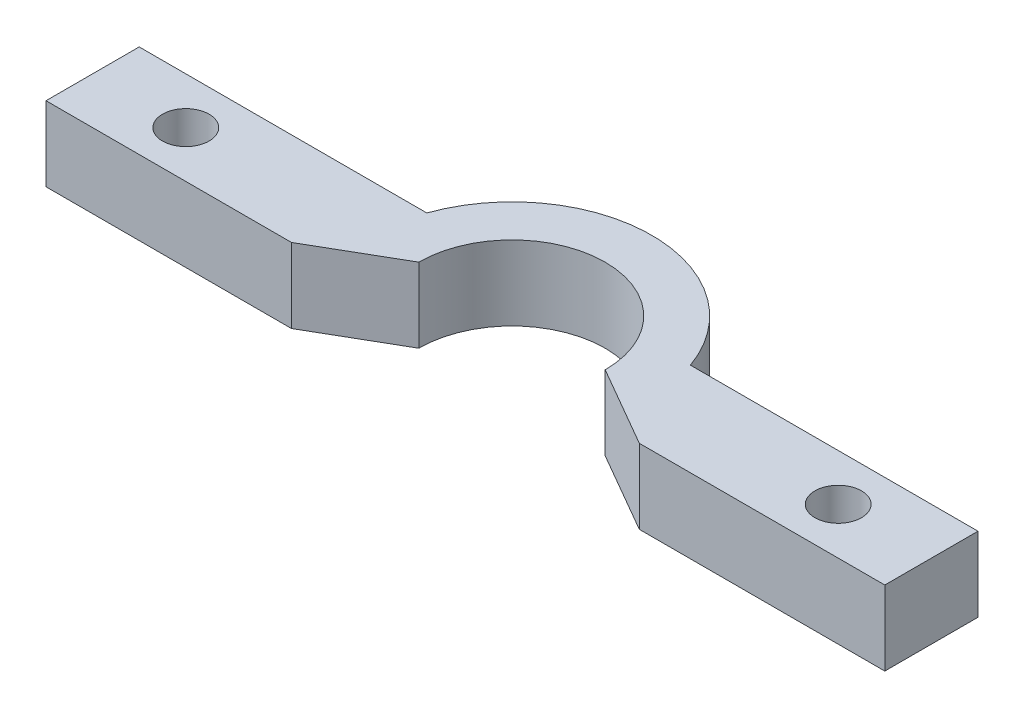
ISO-10303-21;
HEADER;
FILE_DESCRIPTION(('STEP AP214'),'2;1');
FILE_NAME('part.step','',(''),(''),'','','');
FILE_SCHEMA(('AUTOMOTIVE_DESIGN { 1 0 10303 214 1 1 1 1 }'));
ENDSEC;
DATA;
#1=APPLICATION_CONTEXT('core data for automotive mechanical design processes');
#2=APPLICATION_PROTOCOL_DEFINITION('international standard','automotive_design',2000,#1);
#3=PRODUCT_CONTEXT('',#1,'mechanical');
#4=PRODUCT('Part','Part','',(#3));
#5=PRODUCT_RELATED_PRODUCT_CATEGORY('part','',(#4));
#6=PRODUCT_DEFINITION_FORMATION('','',#4);
#7=PRODUCT_DEFINITION_CONTEXT('part definition',#1,'design');
#8=PRODUCT_DEFINITION('design','',#6,#7);
#9=PRODUCT_DEFINITION_SHAPE('','',#8);
#10=(LENGTH_UNIT() NAMED_UNIT(*) SI_UNIT(.MILLI.,.METRE.));
#11=(NAMED_UNIT(*) PLANE_ANGLE_UNIT() SI_UNIT($,.RADIAN.));
#12=(NAMED_UNIT(*) SI_UNIT($,.STERADIAN.) SOLID_ANGLE_UNIT());
#13=UNCERTAINTY_MEASURE_WITH_UNIT(LENGTH_MEASURE(1.E-05),#10,'distance_accuracy_value','');
#14=(GEOMETRIC_REPRESENTATION_CONTEXT(3) GLOBAL_UNCERTAINTY_ASSIGNED_CONTEXT((#13)) GLOBAL_UNIT_ASSIGNED_CONTEXT((#10,
#11,#12)) REPRESENTATION_CONTEXT('',''));
#15=CARTESIAN_POINT('',(0.,0.,0.));
#16=DIRECTION('',(0.,0.,1.));
#17=DIRECTION('',(1.,0.,0.));
#18=AXIS2_PLACEMENT_3D('',#15,#16,#17);
#19=CARTESIAN_POINT('',(-0.793750000000001,1.27,-1.3748153285078));
#20=DIRECTION('',(0.5,0.,0.866025403784439));
#21=DIRECTION('',(0.866025403784439,0.,-0.5));
#22=AXIS2_PLACEMENT_3D('',#19,#20,#21);
#23=PLANE('',#22);
#24=DIRECTION('',(-0.866025403784439,0.,0.5));
#25=VECTOR('',#24,1.);
#26=CARTESIAN_POINT('',(-0.793750000000001,-1.27,-1.3748153285078));
#27=LINE('',#26,#25);
#28=CARTESIAN_POINT('',(-3.175,-1.27,0.));
#29=VERTEX_POINT('',#28);
#30=CARTESIAN_POINT('',(-5.9246306570156,-1.27,1.5875));
#31=VERTEX_POINT('',#30);
#32=EDGE_CURVE('E149',#29,#31,#27,.T.);
#33=ORIENTED_EDGE('',*,*,#32,.F.);
#34=DIRECTION('',(0.,-1.,0.));
#35=VECTOR('',#34,1.);
#36=CARTESIAN_POINT('',(-3.175,1.27,0.));
#37=LINE('',#36,#35);
#38=CARTESIAN_POINT('',(-3.175,1.27,0.));
#39=VERTEX_POINT('',#38);
#40=EDGE_CURVE('E11',#39,#29,#37,.T.);
#41=ORIENTED_EDGE('',*,*,#40,.F.);
#42=DIRECTION('',(-0.866025403784439,0.,0.5));
#43=VECTOR('',#42,1.);
#44=CARTESIAN_POINT('',(-0.793750000000001,1.27,-1.3748153285078));
#45=LINE('',#44,#43);
#46=CARTESIAN_POINT('',(-5.9246306570156,1.27,1.5875));
#47=VERTEX_POINT('',#46);
#48=EDGE_CURVE('E215',#39,#47,#45,.T.);
#49=ORIENTED_EDGE('',*,*,#48,.T.);
#50=DIRECTION('',(0.,-1.,0.));
#51=VECTOR('',#50,1.);
#52=CARTESIAN_POINT('',(-5.9246306570156,1.27,1.5875));
#53=LINE('',#52,#51);
#54=EDGE_CURVE('E93',#47,#31,#53,.T.);
#55=ORIENTED_EDGE('',*,*,#54,.T.);
#56=EDGE_LOOP('',(#33,#41,#49,#55));
#57=FACE_BOUND('',#56,.T.);
#58=ADVANCED_FACE('F36',(#57),#23,.T.);
#59=CARTESIAN_POINT('',(0.,1.27,0.));
#60=DIRECTION('',(0.,-1.,0.));
#61=DIRECTION('',(0.,0.,-1.));
#62=AXIS2_PLACEMENT_3D('',#59,#60,#61);
#63=CYLINDRICAL_SURFACE('',#62,3.175);
#64=CARTESIAN_POINT('',(0.,-1.27,0.));
#65=DIRECTION('',(0.,1.,0.));
#66=DIRECTION('',(0.,0.,1.));
#67=AXIS2_PLACEMENT_3D('',#64,#65,#66);
#68=CIRCLE('',#67,3.175);
#69=CARTESIAN_POINT('',(3.175,-1.27,0.));
#70=VERTEX_POINT('',#69);
#71=EDGE_CURVE('E152',#70,#29,#68,.T.);
#72=ORIENTED_EDGE('',*,*,#71,.F.);
#73=DIRECTION('',(0.,-1.,0.));
#74=VECTOR('',#73,1.);
#75=CARTESIAN_POINT('',(3.175,1.27,0.));
#76=LINE('',#75,#74);
#77=CARTESIAN_POINT('',(3.175,1.27,0.));
#78=VERTEX_POINT('',#77);
#79=EDGE_CURVE('E45',#78,#70,#76,.T.);
#80=ORIENTED_EDGE('',*,*,#79,.F.);
#81=CARTESIAN_POINT('',(0.,1.27,0.));
#82=DIRECTION('',(0.,1.,0.));
#83=DIRECTION('',(0.,0.,1.));
#84=AXIS2_PLACEMENT_3D('',#81,#82,#83);
#85=CIRCLE('',#84,3.175);
#86=EDGE_CURVE('E213',#78,#39,#85,.T.);
#87=ORIENTED_EDGE('',*,*,#86,.T.);
#88=ORIENTED_EDGE('',*,*,#40,.T.);
#89=EDGE_LOOP('',(#72,#80,#87,#88));
#90=FACE_BOUND('',#89,.T.);
#91=ADVANCED_FACE('F200',(#90),#63,.F.);
#92=CARTESIAN_POINT('',(0.793750000000001,1.27,-1.3748153285078));
#93=DIRECTION('',(-0.5,0.,0.866025403784439));
#94=DIRECTION('',(0.866025403784439,0.,0.5));
#95=AXIS2_PLACEMENT_3D('',#92,#93,#94);
#96=PLANE('',#95);
#97=DIRECTION('',(-0.866025403784439,0.,-0.5));
#98=VECTOR('',#97,1.);
#99=CARTESIAN_POINT('',(0.793750000000001,-1.27,-1.3748153285078));
#100=LINE('',#99,#98);
#101=CARTESIAN_POINT('',(5.92463065701559,-1.27,1.5875));
#102=VERTEX_POINT('',#101);
#103=EDGE_CURVE('E155',#102,#70,#100,.T.);
#104=ORIENTED_EDGE('',*,*,#103,.F.);
#105=DIRECTION('',(0.,-1.,0.));
#106=VECTOR('',#105,1.);
#107=CARTESIAN_POINT('',(5.92463065701559,1.27,1.5875));
#108=LINE('',#107,#106);
#109=CARTESIAN_POINT('',(5.92463065701559,1.27,1.5875));
#110=VERTEX_POINT('',#109);
#111=EDGE_CURVE('E189',#110,#102,#108,.T.);
#112=ORIENTED_EDGE('',*,*,#111,.F.);
#113=DIRECTION('',(-0.866025403784439,0.,-0.5));
#114=VECTOR('',#113,1.);
#115=CARTESIAN_POINT('',(0.793750000000001,1.27,-1.3748153285078));
#116=LINE('',#115,#114);
#117=EDGE_CURVE('E196',#110,#78,#116,.T.);
#118=ORIENTED_EDGE('',*,*,#117,.T.);
#119=ORIENTED_EDGE('',*,*,#79,.T.);
#120=EDGE_LOOP('',(#104,#112,#118,#119));
#121=FACE_BOUND('',#120,.T.);
#122=ADVANCED_FACE('F194',(#121),#96,.T.);
#123=CARTESIAN_POINT('',(0.,1.27,1.5875));
#124=DIRECTION('',(0.,0.,-1.));
#125=DIRECTION('',(-1.,0.,0.));
#126=AXIS2_PLACEMENT_3D('',#123,#124,#125);
#127=PLANE('',#126);
#128=DIRECTION('',(1.,0.,0.));
#129=VECTOR('',#128,1.);
#130=CARTESIAN_POINT('',(0.,-1.27,1.5875));
#131=LINE('',#130,#129);
#132=CARTESIAN_POINT('',(14.2875,-1.27,1.5875));
#133=VERTEX_POINT('',#132);
#134=EDGE_CURVE('E158',#102,#133,#131,.T.);
#135=ORIENTED_EDGE('',*,*,#134,.T.);
#136=DIRECTION('',(0.,-1.,0.));
#137=VECTOR('',#136,1.);
#138=CARTESIAN_POINT('',(14.2875,1.27,1.5875));
#139=LINE('',#138,#137);
#140=CARTESIAN_POINT('',(14.2875,1.27,1.5875));
#141=VERTEX_POINT('',#140);
#142=EDGE_CURVE('E186',#141,#133,#139,.T.);
#143=ORIENTED_EDGE('',*,*,#142,.F.);
#144=DIRECTION('',(1.,0.,0.));
#145=VECTOR('',#144,1.);
#146=CARTESIAN_POINT('',(0.,1.27,1.5875));
#147=LINE('',#146,#145);
#148=EDGE_CURVE('E210',#110,#141,#147,.T.);
#149=ORIENTED_EDGE('',*,*,#148,.F.);
#150=ORIENTED_EDGE('',*,*,#111,.T.);
#151=EDGE_LOOP('',(#135,#143,#149,#150));
#152=FACE_BOUND('',#151,.T.);
#153=ADVANCED_FACE('F207',(#152),#127,.F.);
#154=CARTESIAN_POINT('',(14.2875,1.27,0.));
#155=DIRECTION('',(-1.,0.,0.));
#156=DIRECTION('',(0.,0.,1.));
#157=AXIS2_PLACEMENT_3D('',#154,#155,#156);
#158=PLANE('',#157);
#159=DIRECTION('',(0.,0.,-1.));
#160=VECTOR('',#159,1.);
#161=CARTESIAN_POINT('',(14.2875,-1.27,0.));
#162=LINE('',#161,#160);
#163=CARTESIAN_POINT('',(14.2875,-1.27,-1.5875));
#164=VERTEX_POINT('',#163);
#165=EDGE_CURVE('E161',#133,#164,#162,.T.);
#166=ORIENTED_EDGE('',*,*,#165,.T.);
#167=DIRECTION('',(0.,-1.,0.));
#168=VECTOR('',#167,1.);
#169=CARTESIAN_POINT('',(14.2875,1.27,-1.5875));
#170=LINE('',#169,#168);
#171=CARTESIAN_POINT('',(14.2875,1.27,-1.5875));
#172=VERTEX_POINT('',#171);
#173=EDGE_CURVE('E184',#172,#164,#170,.T.);
#174=ORIENTED_EDGE('',*,*,#173,.F.);
#175=DIRECTION('',(0.,0.,-1.));
#176=VECTOR('',#175,1.);
#177=CARTESIAN_POINT('',(14.2875,1.27,0.));
#178=LINE('',#177,#176);
#179=EDGE_CURVE('E211',#141,#172,#178,.T.);
#180=ORIENTED_EDGE('',*,*,#179,.F.);
#181=ORIENTED_EDGE('',*,*,#142,.T.);
#182=EDGE_LOOP('',(#166,#174,#180,#181));
#183=FACE_BOUND('',#182,.T.);
#184=ADVANCED_FACE('F227',(#183),#158,.F.);
#185=CARTESIAN_POINT('',(0.,1.27,-1.5875));
#186=DIRECTION('',(0.,0.,-1.));
#187=DIRECTION('',(-1.,0.,0.));
#188=AXIS2_PLACEMENT_3D('',#185,#186,#187);
#189=PLANE('',#188);
#190=DIRECTION('',(1.,0.,0.));
#191=VECTOR('',#190,1.);
#192=CARTESIAN_POINT('',(0.,-1.27,-1.5875));
#193=LINE('',#192,#191);
#194=CARTESIAN_POINT('',(4.49012806053458,-1.27,-1.5875));
#195=VERTEX_POINT('',#194);
#196=EDGE_CURVE('E164',#195,#164,#193,.T.);
#197=ORIENTED_EDGE('',*,*,#196,.F.);
#198=DIRECTION('',(0.,-1.,0.));
#199=VECTOR('',#198,1.);
#200=CARTESIAN_POINT('',(4.49012806053458,1.27,-1.5875));
#201=LINE('',#200,#199);
#202=CARTESIAN_POINT('',(4.49012806053458,1.27,-1.5875));
#203=VERTEX_POINT('',#202);
#204=EDGE_CURVE('E182',#203,#195,#201,.T.);
#205=ORIENTED_EDGE('',*,*,#204,.F.);
#206=DIRECTION('',(1.,0.,0.));
#207=VECTOR('',#206,1.);
#208=CARTESIAN_POINT('',(0.,1.27,-1.5875));
#209=LINE('',#208,#207);
#210=EDGE_CURVE('E220',#203,#172,#209,.T.);
#211=ORIENTED_EDGE('',*,*,#210,.T.);
#212=ORIENTED_EDGE('',*,*,#173,.T.);
#213=EDGE_LOOP('',(#197,#205,#211,#212));
#214=FACE_BOUND('',#213,.T.);
#215=ADVANCED_FACE('F224',(#214),#189,.T.);
#216=CARTESIAN_POINT('',(0.,1.27,0.));
#217=DIRECTION('',(0.,-1.,0.));
#218=DIRECTION('',(0.,0.,-1.));
#219=AXIS2_PLACEMENT_3D('',#216,#217,#218);
#220=CYLINDRICAL_SURFACE('',#219,4.7625);
#221=CARTESIAN_POINT('',(0.,-1.27,0.));
#222=DIRECTION('',(0.,1.,0.));
#223=DIRECTION('',(0.,0.,1.));
#224=AXIS2_PLACEMENT_3D('',#221,#222,#223);
#225=CIRCLE('',#224,4.7625);
#226=CARTESIAN_POINT('',(-4.49012806053458,-1.27,-1.5875));
#227=VERTEX_POINT('',#226);
#228=EDGE_CURVE('E167',#195,#227,#225,.T.);
#229=ORIENTED_EDGE('',*,*,#228,.T.);
#230=DIRECTION('',(0.,-1.,0.));
#231=VECTOR('',#230,1.);
#232=CARTESIAN_POINT('',(-4.49012806053458,1.27,-1.5875));
#233=LINE('',#232,#231);
#234=CARTESIAN_POINT('',(-4.49012806053458,1.27,-1.5875));
#235=VERTEX_POINT('',#234);
#236=EDGE_CURVE('E128',#235,#227,#233,.T.);
#237=ORIENTED_EDGE('',*,*,#236,.F.);
#238=CARTESIAN_POINT('',(0.,1.27,0.));
#239=DIRECTION('',(0.,1.,0.));
#240=DIRECTION('',(0.,0.,1.));
#241=AXIS2_PLACEMENT_3D('',#238,#239,#240);
#242=CIRCLE('',#241,4.7625);
#243=EDGE_CURVE('E135',#203,#235,#242,.T.);
#244=ORIENTED_EDGE('',*,*,#243,.F.);
#245=ORIENTED_EDGE('',*,*,#204,.T.);
#246=EDGE_LOOP('',(#229,#237,#244,#245));
#247=FACE_BOUND('',#246,.T.);
#248=ADVANCED_FACE('F230',(#247),#220,.T.);
#249=CARTESIAN_POINT('',(0.,1.27,-1.5875));
#250=DIRECTION('',(0.,0.,-1.));
#251=DIRECTION('',(-1.,0.,0.));
#252=AXIS2_PLACEMENT_3D('',#249,#250,#251);
#253=PLANE('',#252);
#254=DIRECTION('',(1.,0.,0.));
#255=VECTOR('',#254,1.);
#256=CARTESIAN_POINT('',(0.,-1.27,-1.5875));
#257=LINE('',#256,#255);
#258=CARTESIAN_POINT('',(-14.2875,-1.27,-1.5875));
#259=VERTEX_POINT('',#258);
#260=EDGE_CURVE('E123',#259,#227,#257,.T.);
#261=ORIENTED_EDGE('',*,*,#260,.F.);
#262=DIRECTION('',(0.,-1.,0.));
#263=VECTOR('',#262,1.);
#264=CARTESIAN_POINT('',(-14.2875,1.27,-1.5875));
#265=LINE('',#264,#263);
#266=CARTESIAN_POINT('',(-14.2875,1.27,-1.5875));
#267=VERTEX_POINT('',#266);
#268=EDGE_CURVE('E118',#267,#259,#265,.T.);
#269=ORIENTED_EDGE('',*,*,#268,.F.);
#270=DIRECTION('',(1.,0.,0.));
#271=VECTOR('',#270,1.);
#272=CARTESIAN_POINT('',(0.,1.27,-1.5875));
#273=LINE('',#272,#271);
#274=EDGE_CURVE('E121',#267,#235,#273,.T.);
#275=ORIENTED_EDGE('',*,*,#274,.T.);
#276=ORIENTED_EDGE('',*,*,#236,.T.);
#277=EDGE_LOOP('',(#261,#269,#275,#276));
#278=FACE_BOUND('',#277,.T.);
#279=ADVANCED_FACE('F120',(#278),#253,.T.);
#280=CARTESIAN_POINT('',(-14.2875,1.27,0.));
#281=DIRECTION('',(-1.,0.,0.));
#282=DIRECTION('',(0.,0.,1.));
#283=AXIS2_PLACEMENT_3D('',#280,#281,#282);
#284=PLANE('',#283);
#285=DIRECTION('',(0.,0.,-1.));
#286=VECTOR('',#285,1.);
#287=CARTESIAN_POINT('',(-14.2875,-1.27,0.));
#288=LINE('',#287,#286);
#289=CARTESIAN_POINT('',(-14.2875,-1.27,1.5875));
#290=VERTEX_POINT('',#289);
#291=EDGE_CURVE('E171',#290,#259,#288,.T.);
#292=ORIENTED_EDGE('',*,*,#291,.F.);
#293=DIRECTION('',(0.,-1.,0.));
#294=VECTOR('',#293,1.);
#295=CARTESIAN_POINT('',(-14.2875,1.27,1.5875));
#296=LINE('',#295,#294);
#297=CARTESIAN_POINT('',(-14.2875,1.27,1.5875));
#298=VERTEX_POINT('',#297);
#299=EDGE_CURVE('E86',#298,#290,#296,.T.);
#300=ORIENTED_EDGE('',*,*,#299,.F.);
#301=DIRECTION('',(0.,0.,-1.));
#302=VECTOR('',#301,1.);
#303=CARTESIAN_POINT('',(-14.2875,1.27,0.));
#304=LINE('',#303,#302);
#305=EDGE_CURVE('E132',#298,#267,#304,.T.);
#306=ORIENTED_EDGE('',*,*,#305,.T.);
#307=ORIENTED_EDGE('',*,*,#268,.T.);
#308=EDGE_LOOP('',(#292,#300,#306,#307));
#309=FACE_BOUND('',#308,.T.);
#310=ADVANCED_FACE('F138',(#309),#284,.T.);
#311=CARTESIAN_POINT('',(0.,1.27,1.5875));
#312=DIRECTION('',(0.,0.,-1.));
#313=DIRECTION('',(-1.,0.,0.));
#314=AXIS2_PLACEMENT_3D('',#311,#312,#313);
#315=PLANE('',#314);
#316=DIRECTION('',(1.,0.,0.));
#317=VECTOR('',#316,1.);
#318=CARTESIAN_POINT('',(0.,-1.27,1.5875));
#319=LINE('',#318,#317);
#320=EDGE_CURVE('E173',#290,#31,#319,.T.);
#321=ORIENTED_EDGE('',*,*,#320,.T.);
#322=ORIENTED_EDGE('',*,*,#54,.F.);
#323=DIRECTION('',(1.,0.,0.));
#324=VECTOR('',#323,1.);
#325=CARTESIAN_POINT('',(0.,1.27,1.5875));
#326=LINE('',#325,#324);
#327=EDGE_CURVE('E53',#298,#47,#326,.T.);
#328=ORIENTED_EDGE('',*,*,#327,.F.);
#329=ORIENTED_EDGE('',*,*,#299,.T.);
#330=EDGE_LOOP('',(#321,#322,#328,#329));
#331=FACE_BOUND('',#330,.T.);
#332=ADVANCED_FACE('F277',(#331),#315,.F.);
#333=CARTESIAN_POINT('',(-11.1125,1.27,0.));
#334=DIRECTION('',(0.,-1.,0.));
#335=DIRECTION('',(0.,0.,-1.));
#336=AXIS2_PLACEMENT_3D('',#333,#334,#335);
#337=CYLINDRICAL_SURFACE('',#336,0.793749999999999);
#338=CARTESIAN_POINT('',(-11.1125,1.27,0.));
#339=DIRECTION('',(0.,1.,0.));
#340=DIRECTION('',(0.,0.,1.));
#341=AXIS2_PLACEMENT_3D('',#338,#339,#340);
#342=CIRCLE('',#341,0.793749999999999);
#343=CARTESIAN_POINT('',(-11.1125,1.27,0.793749999999999));
#344=VERTEX_POINT('',#343);
#345=EDGE_CURVE('E178',#344,#344,#342,.T.);
#346=ORIENTED_EDGE('',*,*,#345,.T.);
#347=EDGE_LOOP('',(#346));
#348=FACE_BOUND('',#347,.T.);
#349=CARTESIAN_POINT('',(-11.1125,-1.27,0.));
#350=DIRECTION('',(0.,1.,0.));
#351=DIRECTION('',(0.,0.,1.));
#352=AXIS2_PLACEMENT_3D('',#349,#350,#351);
#353=CIRCLE('',#352,0.793749999999999);
#354=CARTESIAN_POINT('',(-11.1125,-1.27,0.793749999999999));
#355=VERTEX_POINT('',#354);
#356=EDGE_CURVE('E146',#355,#355,#353,.T.);
#357=ORIENTED_EDGE('',*,*,#356,.F.);
#358=EDGE_LOOP('',(#357));
#359=FACE_BOUND('',#358,.T.);
#360=ADVANCED_FACE('F38',(#348,#359),#337,.F.);
#361=CARTESIAN_POINT('',(11.1125,1.27,0.));
#362=DIRECTION('',(0.,-1.,0.));
#363=DIRECTION('',(0.,0.,-1.));
#364=AXIS2_PLACEMENT_3D('',#361,#362,#363);
#365=CYLINDRICAL_SURFACE('',#364,0.793749999999999);
#366=CARTESIAN_POINT('',(11.1125,1.27,0.));
#367=DIRECTION('',(0.,1.,0.));
#368=DIRECTION('',(0.,0.,1.));
#369=AXIS2_PLACEMENT_3D('',#366,#367,#368);
#370=CIRCLE('',#369,0.793749999999999);
#371=CARTESIAN_POINT('',(11.1125,1.27,0.793749999999999));
#372=VERTEX_POINT('',#371);
#373=EDGE_CURVE('E140',#372,#372,#370,.T.);
#374=ORIENTED_EDGE('',*,*,#373,.T.);
#375=EDGE_LOOP('',(#374));
#376=FACE_BOUND('',#375,.T.);
#377=CARTESIAN_POINT('',(11.1125,-1.27,0.));
#378=DIRECTION('',(0.,1.,0.));
#379=DIRECTION('',(0.,0.,1.));
#380=AXIS2_PLACEMENT_3D('',#377,#378,#379);
#381=CIRCLE('',#380,0.793749999999999);
#382=CARTESIAN_POINT('',(11.1125,-1.27,0.793749999999999));
#383=VERTEX_POINT('',#382);
#384=EDGE_CURVE('E175',#383,#383,#381,.T.);
#385=ORIENTED_EDGE('',*,*,#384,.F.);
#386=EDGE_LOOP('',(#385));
#387=FACE_BOUND('',#386,.T.);
#388=ADVANCED_FACE('F294',(#376,#387),#365,.F.);
#389=CARTESIAN_POINT('',(0.,1.27,0.));
#390=DIRECTION('',(0.,1.,0.));
#391=DIRECTION('',(0.,0.,1.));
#392=AXIS2_PLACEMENT_3D('',#389,#390,#391);
#393=PLANE('',#392);
#394=ORIENTED_EDGE('',*,*,#345,.F.);
#395=EDGE_LOOP('',(#394));
#396=FACE_BOUND('',#395,.T.);
#397=ORIENTED_EDGE('',*,*,#48,.F.);
#398=ORIENTED_EDGE('',*,*,#86,.F.);
#399=ORIENTED_EDGE('',*,*,#117,.F.);
#400=ORIENTED_EDGE('',*,*,#148,.T.);
#401=ORIENTED_EDGE('',*,*,#179,.T.);
#402=ORIENTED_EDGE('',*,*,#210,.F.);
#403=ORIENTED_EDGE('',*,*,#243,.T.);
#404=ORIENTED_EDGE('',*,*,#274,.F.);
#405=ORIENTED_EDGE('',*,*,#305,.F.);
#406=ORIENTED_EDGE('',*,*,#327,.T.);
#407=EDGE_LOOP('',(#397,#398,#399,#400,#401,#402,#403,#404,#405,#406));
#408=FACE_BOUND('',#407,.T.);
#409=ORIENTED_EDGE('',*,*,#373,.F.);
#410=EDGE_LOOP('',(#409));
#411=FACE_BOUND('',#410,.T.);
#412=ADVANCED_FACE('F130',(#396,#408,#411),#393,.T.);
#413=CARTESIAN_POINT('',(0.,-1.27,0.));
#414=DIRECTION('',(0.,1.,0.));
#415=DIRECTION('',(0.,0.,1.));
#416=AXIS2_PLACEMENT_3D('',#413,#414,#415);
#417=PLANE('',#416);
#418=ORIENTED_EDGE('',*,*,#356,.T.);
#419=EDGE_LOOP('',(#418));
#420=FACE_BOUND('',#419,.T.);
#421=ORIENTED_EDGE('',*,*,#32,.T.);
#422=ORIENTED_EDGE('',*,*,#320,.F.);
#423=ORIENTED_EDGE('',*,*,#291,.T.);
#424=ORIENTED_EDGE('',*,*,#260,.T.);
#425=ORIENTED_EDGE('',*,*,#228,.F.);
#426=ORIENTED_EDGE('',*,*,#196,.T.);
#427=ORIENTED_EDGE('',*,*,#165,.F.);
#428=ORIENTED_EDGE('',*,*,#134,.F.);
#429=ORIENTED_EDGE('',*,*,#103,.T.);
#430=ORIENTED_EDGE('',*,*,#71,.T.);
#431=EDGE_LOOP('',(#421,#422,#423,#424,#425,#426,#427,#428,#429,#430));
#432=FACE_BOUND('',#431,.T.);
#433=ORIENTED_EDGE('',*,*,#384,.T.);
#434=EDGE_LOOP('',(#433));
#435=FACE_BOUND('',#434,.T.);
#436=ADVANCED_FACE('F203',(#420,#432,#435),#417,.F.);
#437=CLOSED_SHELL('',(#58,#91,#122,#153,#184,#215,#248,#279,#310,#332,#360,#388,#412,#436));
#438=MANIFOLD_SOLID_BREP('B2',#437);
#439=ADVANCED_BREP_SHAPE_REPRESENTATION('',(#18,#438),#14);
#440=SHAPE_DEFINITION_REPRESENTATION(#9,#439);
ENDSEC;
END-ISO-10303-21;
